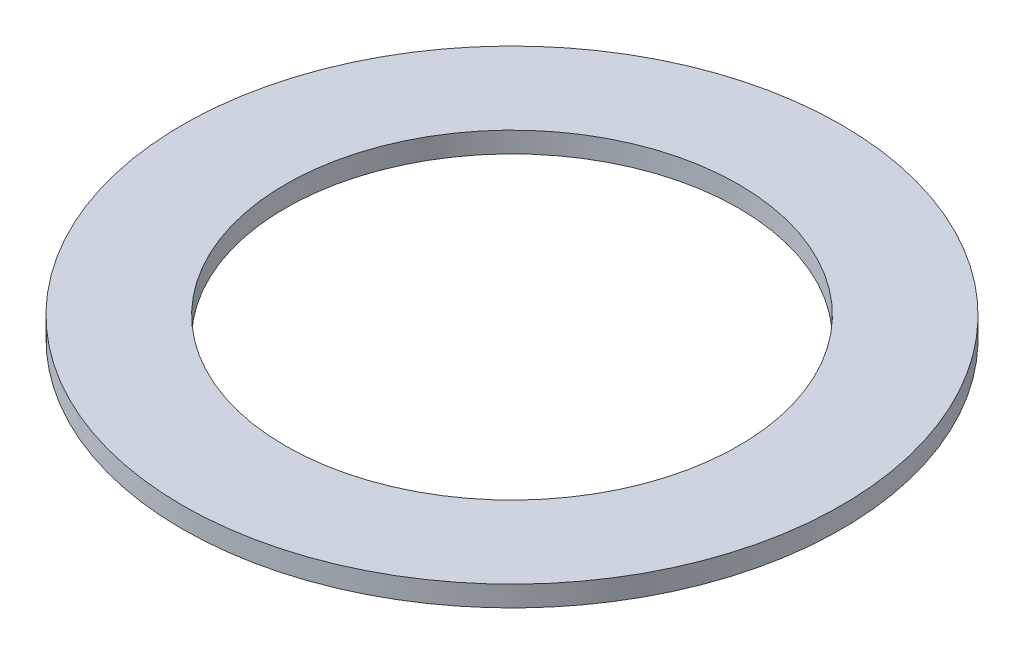
ISO-10303-21;
HEADER;
FILE_DESCRIPTION(('STEP AP214'),'2;1');
FILE_NAME('part.step','',(''),(''),'','','');
FILE_SCHEMA(('AUTOMOTIVE_DESIGN { 1 0 10303 214 1 1 1 1 }'));
ENDSEC;
DATA;
#1=APPLICATION_CONTEXT('core data for automotive mechanical design processes');
#2=APPLICATION_PROTOCOL_DEFINITION('international standard','automotive_design',2000,#1);
#3=PRODUCT_CONTEXT('',#1,'mechanical');
#4=PRODUCT('Part','Part','',(#3));
#5=PRODUCT_RELATED_PRODUCT_CATEGORY('part','',(#4));
#6=PRODUCT_DEFINITION_FORMATION('','',#4);
#7=PRODUCT_DEFINITION_CONTEXT('part definition',#1,'design');
#8=PRODUCT_DEFINITION('design','',#6,#7);
#9=PRODUCT_DEFINITION_SHAPE('','',#8);
#10=(LENGTH_UNIT() NAMED_UNIT(*) SI_UNIT(.MILLI.,.METRE.));
#11=(NAMED_UNIT(*) PLANE_ANGLE_UNIT() SI_UNIT($,.RADIAN.));
#12=(NAMED_UNIT(*) SI_UNIT($,.STERADIAN.) SOLID_ANGLE_UNIT());
#13=UNCERTAINTY_MEASURE_WITH_UNIT(LENGTH_MEASURE(1.E-05),#10,'distance_accuracy_value','');
#14=(GEOMETRIC_REPRESENTATION_CONTEXT(3) GLOBAL_UNCERTAINTY_ASSIGNED_CONTEXT((#13)) GLOBAL_UNIT_ASSIGNED_CONTEXT((#10,
#11,#12)) REPRESENTATION_CONTEXT('',''));
#15=CARTESIAN_POINT('',(0.,0.,0.));
#16=DIRECTION('',(0.,0.,1.));
#17=DIRECTION('',(1.,0.,0.));
#18=AXIS2_PLACEMENT_3D('',#15,#16,#17);
#19=CARTESIAN_POINT('',(50.8,0.,0.));
#20=DIRECTION('',(0.,-1.,0.));
#21=DIRECTION('',(0.,0.,-1.));
#22=AXIS2_PLACEMENT_3D('',#19,#20,#21);
#23=PLANE('',#22);
#24=CARTESIAN_POINT('',(0.,0.,0.));
#25=DIRECTION('',(0.,-1.,0.));
#26=DIRECTION('',(0.,0.,-1.));
#27=AXIS2_PLACEMENT_3D('',#24,#25,#26);
#28=CIRCLE('',#27,50.8);
#29=CARTESIAN_POINT('',(0.,0.,-50.8));
#30=VERTEX_POINT('',#29);
#31=EDGE_CURVE('E46',#30,#30,#28,.T.);
#32=ORIENTED_EDGE('',*,*,#31,.T.);
#33=EDGE_LOOP('',(#32));
#34=FACE_BOUND('',#33,.T.);
#35=CARTESIAN_POINT('',(0.,0.,0.));
#36=DIRECTION('',(0.,-1.,0.));
#37=DIRECTION('',(0.,0.,-1.));
#38=AXIS2_PLACEMENT_3D('',#35,#36,#37);
#39=CIRCLE('',#38,34.925);
#40=CARTESIAN_POINT('',(0.,0.,-34.925));
#41=VERTEX_POINT('',#40);
#42=EDGE_CURVE('E10',#41,#41,#39,.T.);
#43=ORIENTED_EDGE('',*,*,#42,.F.);
#44=EDGE_LOOP('',(#43));
#45=FACE_BOUND('',#44,.T.);
#46=ADVANCED_FACE('F32',(#34,#45),#23,.T.);
#47=CARTESIAN_POINT('',(0.,0.,0.));
#48=DIRECTION('',(0.,-1.,0.));
#49=DIRECTION('',(0.,0.,-1.));
#50=AXIS2_PLACEMENT_3D('',#47,#48,#49);
#51=CYLINDRICAL_SURFACE('',#50,34.925);
#52=ORIENTED_EDGE('',*,*,#42,.T.);
#53=EDGE_LOOP('',(#52));
#54=FACE_BOUND('',#53,.T.);
#55=CARTESIAN_POINT('',(0.,3.175,0.));
#56=DIRECTION('',(0.,-1.,0.));
#57=DIRECTION('',(0.,0.,-1.));
#58=AXIS2_PLACEMENT_3D('',#55,#56,#57);
#59=CIRCLE('',#58,34.925);
#60=CARTESIAN_POINT('',(0.,3.175,-34.925));
#61=VERTEX_POINT('',#60);
#62=EDGE_CURVE('E38',#61,#61,#59,.T.);
#63=ORIENTED_EDGE('',*,*,#62,.F.);
#64=EDGE_LOOP('',(#63));
#65=FACE_BOUND('',#64,.T.);
#66=ADVANCED_FACE('F62',(#54,#65),#51,.F.);
#67=CARTESIAN_POINT('',(34.925,3.175,0.));
#68=DIRECTION('',(0.,1.,0.));
#69=DIRECTION('',(0.,0.,1.));
#70=AXIS2_PLACEMENT_3D('',#67,#68,#69);
#71=PLANE('',#70);
#72=ORIENTED_EDGE('',*,*,#62,.T.);
#73=EDGE_LOOP('',(#72));
#74=FACE_BOUND('',#73,.T.);
#75=CARTESIAN_POINT('',(0.,3.175,0.));
#76=DIRECTION('',(0.,-1.,0.));
#77=DIRECTION('',(0.,0.,-1.));
#78=AXIS2_PLACEMENT_3D('',#75,#76,#77);
#79=CIRCLE('',#78,50.8);
#80=CARTESIAN_POINT('',(0.,3.175,-50.8));
#81=VERTEX_POINT('',#80);
#82=EDGE_CURVE('E42',#81,#81,#79,.T.);
#83=ORIENTED_EDGE('',*,*,#82,.F.);
#84=EDGE_LOOP('',(#83));
#85=FACE_BOUND('',#84,.T.);
#86=ADVANCED_FACE('F56',(#74,#85),#71,.T.);
#87=CARTESIAN_POINT('',(0.,0.,0.));
#88=DIRECTION('',(0.,-1.,0.));
#89=DIRECTION('',(0.,0.,-1.));
#90=AXIS2_PLACEMENT_3D('',#87,#88,#89);
#91=CYLINDRICAL_SURFACE('',#90,50.8);
#92=ORIENTED_EDGE('',*,*,#82,.T.);
#93=EDGE_LOOP('',(#92));
#94=FACE_BOUND('',#93,.T.);
#95=ORIENTED_EDGE('',*,*,#31,.F.);
#96=EDGE_LOOP('',(#95));
#97=FACE_BOUND('',#96,.T.);
#98=ADVANCED_FACE('F54',(#94,#97),#91,.T.);
#99=CLOSED_SHELL('',(#46,#66,#86,#98));
#100=MANIFOLD_SOLID_BREP('B2',#99);
#101=ADVANCED_BREP_SHAPE_REPRESENTATION('',(#18,#100),#14);
#102=SHAPE_DEFINITION_REPRESENTATION(#9,#101);
ENDSEC;
END-ISO-10303-21;
